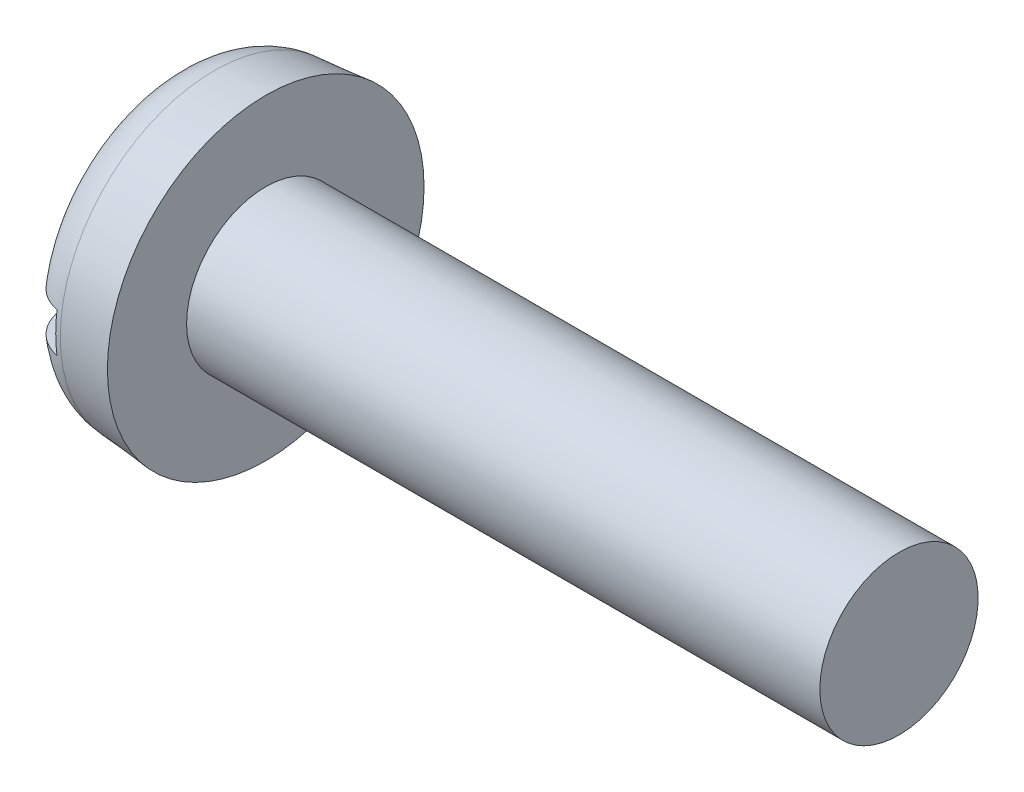
ISO-10303-21;
HEADER;
FILE_DESCRIPTION(('STEP AP214'),'2;1');
FILE_NAME('part.step','',(''),(''),'','','');
FILE_SCHEMA(('AUTOMOTIVE_DESIGN { 1 0 10303 214 1 1 1 1 }'));
ENDSEC;
DATA;
#1=APPLICATION_CONTEXT('core data for automotive mechanical design processes');
#2=APPLICATION_PROTOCOL_DEFINITION('international standard','automotive_design',2000,#1);
#3=PRODUCT_CONTEXT('',#1,'mechanical');
#4=PRODUCT('Part','Part','',(#3));
#5=PRODUCT_RELATED_PRODUCT_CATEGORY('part','',(#4));
#6=PRODUCT_DEFINITION_FORMATION('','',#4);
#7=PRODUCT_DEFINITION_CONTEXT('part definition',#1,'design');
#8=PRODUCT_DEFINITION('design','',#6,#7);
#9=PRODUCT_DEFINITION_SHAPE('','',#8);
#10=(LENGTH_UNIT() NAMED_UNIT(*) SI_UNIT(.MILLI.,.METRE.));
#11=(NAMED_UNIT(*) PLANE_ANGLE_UNIT() SI_UNIT($,.RADIAN.));
#12=(NAMED_UNIT(*) SI_UNIT($,.STERADIAN.) SOLID_ANGLE_UNIT());
#13=UNCERTAINTY_MEASURE_WITH_UNIT(LENGTH_MEASURE(1.E-05),#10,'distance_accuracy_value','');
#14=(GEOMETRIC_REPRESENTATION_CONTEXT(3) GLOBAL_UNCERTAINTY_ASSIGNED_CONTEXT((#13)) GLOBAL_UNIT_ASSIGNED_CONTEXT((#10,
#11,#12)) REPRESENTATION_CONTEXT('',''));
#15=CARTESIAN_POINT('',(0.,0.,0.));
#16=DIRECTION('',(0.,0.,1.));
#17=DIRECTION('',(1.,0.,0.));
#18=AXIS2_PLACEMENT_3D('',#15,#16,#17);
#19=CARTESIAN_POINT('',(0.,0.,0.));
#20=DIRECTION('',(-1.,0.,0.));
#21=DIRECTION('',(0.,0.,1.));
#22=AXIS2_PLACEMENT_3D('',#19,#20,#21);
#23=PLANE('',#22);
#24=DIRECTION('',(0.,0.,-1.));
#25=VECTOR('',#24,1.);
#26=CARTESIAN_POINT('',(0.,1.25,10.));
#27=LINE('',#26,#25);
#28=CARTESIAN_POINT('',(0.,1.25,6.60890143188702));
#29=VERTEX_POINT('',#28);
#30=CARTESIAN_POINT('',(0.,1.25,-6.60890143188702));
#31=VERTEX_POINT('',#30);
#32=EDGE_CURVE('E87',#29,#31,#27,.T.);
#33=ORIENTED_EDGE('',*,*,#32,.F.);
#34=CARTESIAN_POINT('',(0.,0.,0.));
#35=DIRECTION('',(-1.,0.,0.));
#36=DIRECTION('',(0.,0.,1.));
#37=AXIS2_PLACEMENT_3D('',#34,#35,#36);
#38=CIRCLE('',#37,6.72607449679219);
#39=EDGE_CURVE('E93',#29,#31,#38,.T.);
#40=ORIENTED_EDGE('',*,*,#39,.T.);
#41=EDGE_LOOP('',(#33,#40));
#42=FACE_BOUND('',#41,.T.);
#43=ADVANCED_FACE('F34',(#42),#23,.T.);
#44=CARTESIAN_POINT('',(-25.4,0.,0.));
#45=DIRECTION('',(-1.,0.,0.));
#46=DIRECTION('',(0.,0.,1.));
#47=AXIS2_PLACEMENT_3D('',#44,#45,#46);
#48=CYLINDRICAL_SURFACE('',#47,5.);
#49=CARTESIAN_POINT('',(46.,0.,0.));
#50=DIRECTION('',(-1.,0.,0.));
#51=DIRECTION('',(0.,0.,1.));
#52=AXIS2_PLACEMENT_3D('',#49,#50,#51);
#53=CIRCLE('',#52,5.);
#54=CARTESIAN_POINT('',(46.,0.,5.));
#55=VERTEX_POINT('',#54);
#56=EDGE_CURVE('E150',#55,#55,#53,.T.);
#57=ORIENTED_EDGE('',*,*,#56,.T.);
#58=EDGE_LOOP('',(#57));
#59=FACE_BOUND('',#58,.T.);
#60=CARTESIAN_POINT('',(6.,0.,0.));
#61=DIRECTION('',(-1.,0.,0.));
#62=DIRECTION('',(0.,0.,1.));
#63=AXIS2_PLACEMENT_3D('',#60,#61,#62);
#64=CIRCLE('',#63,5.);
#65=CARTESIAN_POINT('',(6.,0.,5.));
#66=VERTEX_POINT('',#65);
#67=EDGE_CURVE('E94',#66,#66,#64,.T.);
#68=ORIENTED_EDGE('',*,*,#67,.F.);
#69=EDGE_LOOP('',(#68));
#70=FACE_BOUND('',#69,.T.);
#71=ADVANCED_FACE('F139',(#59,#70),#48,.T.);
#72=CARTESIAN_POINT('',(6.,5.,0.));
#73=DIRECTION('',(-1.,0.,0.));
#74=DIRECTION('',(0.,0.,1.));
#75=AXIS2_PLACEMENT_3D('',#72,#73,#74);
#76=PLANE('',#75);
#77=CARTESIAN_POINT('',(6.,0.,0.));
#78=DIRECTION('',(-1.,0.,0.));
#79=DIRECTION('',(0.,0.,1.));
#80=AXIS2_PLACEMENT_3D('',#77,#78,#79);
#81=CIRCLE('',#80,10.);
#82=CARTESIAN_POINT('',(6.,0.,10.));
#83=VERTEX_POINT('',#82);
#84=EDGE_CURVE('E99',#83,#83,#81,.T.);
#85=ORIENTED_EDGE('',*,*,#84,.F.);
#86=EDGE_LOOP('',(#85));
#87=FACE_BOUND('',#86,.T.);
#88=ORIENTED_EDGE('',*,*,#67,.T.);
#89=EDGE_LOOP('',(#88));
#90=FACE_BOUND('',#89,.T.);
#91=ADVANCED_FACE('F136',(#87,#90),#76,.F.);
#92=CARTESIAN_POINT('',(0.,0.,0.));
#93=DIRECTION('',(1.,0.,0.));
#94=DIRECTION('',(0.,0.,-1.));
#95=AXIS2_PLACEMENT_3D('',#92,#93,#94);
#96=CONICAL_SURFACE('',#95,9.47506801884446,0.0872664625997167);
#97=CARTESIAN_POINT('',(2.73853277175704,0.,0.));
#98=DIRECTION('',(-1.,0.,0.));
#99=DIRECTION('',(0.,0.,1.));
#100=AXIS2_PLACEMENT_3D('',#97,#98,#99);
#101=CIRCLE('',#100,9.71465859106742);
#102=CARTESIAN_POINT('',(2.73853277175704,0.,9.71465859106742));
#103=VERTEX_POINT('',#102);
#104=EDGE_CURVE('E97',#103,#103,#101,.F.);
#105=ORIENTED_EDGE('',*,*,#104,.T.);
#106=EDGE_LOOP('',(#105));
#107=FACE_BOUND('',#106,.T.);
#108=ORIENTED_EDGE('',*,*,#84,.T.);
#109=EDGE_LOOP('',(#108));
#110=FACE_BOUND('',#109,.T.);
#111=ADVANCED_FACE('F133',(#107,#110),#96,.T.);
#112=DIRECTION('',(0.,0.,1.));
#113=VECTOR('',#112,1.);
#114=CARTESIAN_POINT('',(0.,-1.25,-10.));
#115=LINE('',#114,#113);
#116=CARTESIAN_POINT('',(0.,-1.25,-6.60890143188702));
#117=VERTEX_POINT('',#116);
#118=CARTESIAN_POINT('',(0.,-1.25,6.60890143188702));
#119=VERTEX_POINT('',#118);
#120=EDGE_CURVE('E78',#117,#119,#115,.T.);
#121=ORIENTED_EDGE('',*,*,#120,.F.);
#122=EDGE_CURVE('E85',#117,#119,#38,.T.);
#123=ORIENTED_EDGE('',*,*,#122,.T.);
#124=EDGE_LOOP('',(#121,#123));
#125=FACE_BOUND('',#124,.T.);
#126=ADVANCED_FACE('F84',(#125),#23,.T.);
#127=CARTESIAN_POINT('',(46.,5.,0.));
#128=DIRECTION('',(1.,0.,0.));
#129=DIRECTION('',(0.,0.,-1.));
#130=AXIS2_PLACEMENT_3D('',#127,#128,#129);
#131=PLANE('',#130);
#132=ORIENTED_EDGE('',*,*,#56,.F.);
#133=EDGE_LOOP('',(#132));
#134=FACE_BOUND('',#133,.T.);
#135=ADVANCED_FACE('F126',(#134),#131,.T.);
#136=CARTESIAN_POINT('',(3.,0.,0.));
#137=DIRECTION('',(-1.,0.,0.));
#138=DIRECTION('',(0.,0.,1.));
#139=AXIS2_PLACEMENT_3D('',#136,#137,#138);
#140=TOROIDAL_SURFACE('',#139,6.72607449679219,3.);
#141=CARTESIAN_POINT('',(1.34081251292592,1.25,-9.14041771270556));
#142=CARTESIAN_POINT('',(1.47997004569424,1.25,-9.23364559309569));
#143=CARTESIAN_POINT('',(1.62706942158313,1.25,-9.31523086751065));
#144=CARTESIAN_POINT('',(1.93299124224696,1.25,-9.45262888060047));
#145=CARTESIAN_POINT('',(2.09182681215025,1.25,-9.50841224196599));
#146=CARTESIAN_POINT('',(2.41658159251928,1.25,-9.59246600820484));
#147=CARTESIAN_POINT('',(2.582498533532,1.25,-9.62074515959099));
#148=CARTESIAN_POINT('',(2.91668270329018,1.25,-9.64897084033708));
#149=CARTESIAN_POINT('',(3.08494936349241,1.25,-9.64892410865453));
#150=CARTESIAN_POINT('',(3.41873792670578,1.25,-9.6205489149463));
#151=CARTESIAN_POINT('',(3.58426467998157,1.25,-9.59227747883712));
#152=CARTESIAN_POINT('',(3.9082324846902,1.25,-9.50836629256408));
#153=CARTESIAN_POINT('',(4.06667331296119,1.25,-9.45272568110538));
#154=CARTESIAN_POINT('',(4.37212351875608,1.25,-9.31564696311505));
#155=CARTESIAN_POINT('',(4.51912348159581,1.25,-9.23418788439128));
#156=CARTESIAN_POINT('',(4.79744436134885,1.25,-9.04785785761537));
#157=CARTESIAN_POINT('',(4.92876507107146,1.25,-8.94298660023973));
#158=CARTESIAN_POINT('',(5.17270515894009,1.25,-8.71230286795266));
#159=CARTESIAN_POINT('',(5.28523171361335,1.25,-8.58639226002281));
#160=CARTESIAN_POINT('',(5.48776799061373,1.25,-8.31761117398391));
#161=CARTESIAN_POINT('',(5.57777697392869,1.25,-8.17474013947146));
#162=CARTESIAN_POINT('',(5.73362485853236,1.25,-7.87474584170421));
#163=CARTESIAN_POINT('',(5.79923985500485,1.25,-7.71750629633249));
#164=CARTESIAN_POINT('',(5.90351740818828,1.25,-7.39433678343106));
#165=CARTESIAN_POINT('',(5.94217838759054,1.25,-7.22840630793192));
#166=CARTESIAN_POINT('',(5.99202504296818,1.25,-6.8902471150863));
#167=CARTESIAN_POINT('',(6.0028436876831,1.25,-6.71796433394903));
#168=CARTESIAN_POINT('',(5.99588219118269,1.25,-6.37398151667962));
#169=CARTESIAN_POINT('',(5.97809968117614,1.25,-6.20228152999566));
#170=CARTESIAN_POINT('',(5.91412563432089,1.25,-5.86143261724803));
#171=CARTESIAN_POINT('',(5.86748736278875,1.25,-5.69236752441071));
#172=CARTESIAN_POINT('',(5.74686216088372,1.25,-5.36428557101799));
#173=CARTESIAN_POINT('',(5.67287236389949,1.25,-5.20526976573717));
#174=CARTESIAN_POINT('',(5.49848893509047,1.25,-4.89968131495403));
#175=CARTESIAN_POINT('',(5.3977652792538,1.25,-4.75329681574793));
#176=CARTESIAN_POINT('',(5.17308325743016,1.25,-4.47955663710009));
#177=CARTESIAN_POINT('',(5.04912274702775,1.25,-4.3522027158481));
#178=CARTESIAN_POINT('',(4.78177797255637,1.25,-4.12101899516749));
#179=CARTESIAN_POINT('',(4.63847541785345,1.25,-4.0170949006365));
#180=CARTESIAN_POINT('',(4.33591165308452,1.25,-3.83586047496544));
#181=CARTESIAN_POINT('',(4.17665481124267,1.25,-3.75854288463707));
#182=CARTESIAN_POINT('',(3.85300941665427,1.25,-3.63615461860417));
#183=CARTESIAN_POINT('',(3.68903889213839,1.25,-3.58998088339251));
#184=CARTESIAN_POINT('',(3.35552430862095,1.25,-3.52750009872167));
#185=CARTESIAN_POINT('',(3.18598268929377,1.25,-3.51118014865231));
#186=CARTESIAN_POINT('',(2.85540041439991,1.25,-3.50925867978971));
#187=CARTESIAN_POINT('',(2.69436660193266,1.25,-3.52213490652204));
#188=CARTESIAN_POINT('',(2.37679746951337,1.25,-3.57489222130239));
#189=CARTESIAN_POINT('',(2.22026226562944,1.25,-3.61477400546699));
#190=CARTESIAN_POINT('',(1.91661079939741,1.25,-3.71960592153277));
#191=CARTESIAN_POINT('',(1.76945756351056,1.25,-3.78444951321494));
#192=CARTESIAN_POINT('',(1.48742680552422,1.25,-3.93683229612311));
#193=CARTESIAN_POINT('',(1.35255176741993,1.25,-4.02437606608381));
#194=CARTESIAN_POINT('',(1.09216492745924,1.25,-4.22401407493451));
#195=CARTESIAN_POINT('',(0.967387650924978,1.25,-4.33706621584735));
#196=CARTESIAN_POINT('',(0.73758515533178,1.25,-4.58172455320384));
#197=CARTESIAN_POINT('',(0.632564121372695,1.25,-4.71333467060289));
#198=CARTESIAN_POINT('',(0.440706744818381,1.25,-4.99764835034063));
#199=CARTESIAN_POINT('',(0.354858371169426,1.25,-5.15101980535205));
#200=CARTESIAN_POINT('',(0.209759739085442,1.25,-5.46987555953257));
#201=CARTESIAN_POINT('',(0.150511854548873,1.25,-5.63536093824835));
#202=CARTESIAN_POINT('',(0.0598248408899945,1.25,-5.97596403674756));
#203=CARTESIAN_POINT('',(0.0287331300301613,1.25,-6.15117451260019));
#204=CARTESIAN_POINT('',(-0.00327991665943455,1.25,-6.50433093601113));
#205=CARTESIAN_POINT('',(-0.0042034483289247,1.25,-6.68227668353502));
#206=CARTESIAN_POINT('',(0.0242494335281846,1.25,-7.03395549202798));
#207=CARTESIAN_POINT('',(0.0533248623160846,1.25,-7.20771284306739));
#208=CARTESIAN_POINT('',(0.140732202567236,1.25,-7.54776258015318));
#209=CARTESIAN_POINT('',(0.199069128576322,1.25,-7.7140536813841));
#210=CARTESIAN_POINT('',(0.342342853890434,1.25,-8.03161087152442));
#211=CARTESIAN_POINT('',(0.426850513461393,1.25,-8.18307087677514));
#212=CARTESIAN_POINT('',(0.620392149606268,1.25,-8.46922964633382));
#213=CARTESIAN_POINT('',(0.729393933384485,1.25,-8.60395005391848));
#214=CARTESIAN_POINT('',(0.923342283736372,1.25,-8.80549358446353));
#215=CARTESIAN_POINT('',(1.00176332541539,1.25,-8.87870697306255));
#216=CARTESIAN_POINT('',(1.16597654194715,1.25,-9.01634176316588));
#217=CARTESIAN_POINT('',(1.25176865758217,1.25,-9.08076323529194));
#218=CARTESIAN_POINT('',(1.34081251292592,1.25,-9.14041771270556));
#219=B_SPLINE_CURVE_WITH_KNOTS('',3,(#141,#142,#143,#144,#145,#146,#147,#148,#149,#150,#151,
#152,#153,#154,#155,#156,#157,#158,#159,#160,#161,#162,#163,#164,#165,#166,#167,#168,#169,#170,
#171,#172,#173,#174,#175,#176,#177,#178,#179,#180,#181,#182,#183,#184,#185,#186,#187,#188,#189,
#190,#191,#192,#193,#194,#195,#196,#197,#198,#199,#200,#201,#202,#203,#204,#205,#206,#207,#208,
#209,#210,#211,#212,#213,#214,#215,#216,#217,#218),.UNSPECIFIED.,.T.,.F.,(4,2,2,2,2,2,2,2,2,2,2,
2,2,2,2,2,2,2,2,2,2,2,2,2,2,2,2,2,2,2,2,2,2,2,2,2,2,2,4),(0.,0.502110766823819,1.00479182360661,
1.50731297231386,2.00971456720754,2.51110314714071,3.012507506542,3.51432020215663,
4.01613952815144,4.52036837756644,5.02461377327644,5.53337945318342,6.04217490279723,
6.55764396986779,7.07315573107046,7.59685536739773,8.1206099062989,8.65115781760801,
9.18175471470999,9.71017647084869,10.238453940464,10.7468704948707,11.2550672970903,
11.7373799480992,12.2197050320531,12.6999939151031,13.1803797501818,13.6832676754649,
14.1862620112653,14.7111036164068,15.2359920505046,15.7672721553405,16.2985135900082,
16.8244763350858,17.3505292452641,17.8683760107229,18.3855461065789,18.706838362612,
19.0281280376886),.UNSPECIFIED.);
#220=CARTESIAN_POINT('',(2.4,1.25,-9.58429232182582));
#221=VERTEX_POINT('',#220);
#222=EDGE_CURVE('E11',#31,#221,#219,.T.);
#223=ORIENTED_EDGE('',*,*,#222,.F.);
#224=ORIENTED_EDGE('',*,*,#39,.F.);
#225=CARTESIAN_POINT('',(1.26382191448386,1.25,4.09288311147665));
#226=CARTESIAN_POINT('',(1.39631174049083,1.25,3.99458178693507));
#227=CARTESIAN_POINT('',(1.53683479419004,1.25,3.90696138563428));
#228=CARTESIAN_POINT('',(1.83053177402466,1.25,3.75610676855322));
#229=CARTESIAN_POINT('',(1.98371360855086,1.25,3.69288793928877));
#230=CARTESIAN_POINT('',(2.29892040884167,1.25,3.59332982093983));
#231=CARTESIAN_POINT('',(2.46096015163632,1.25,3.55703701691806));
#232=CARTESIAN_POINT('',(2.78884813975658,1.25,3.51321694522641));
#233=CARTESIAN_POINT('',(2.95469492654351,1.25,3.50567884028135));
#234=CARTESIAN_POINT('',(3.27994031590815,1.25,3.51948431548739));
#235=CARTESIAN_POINT('',(3.4393779788812,1.25,3.53992920084695));
#236=CARTESIAN_POINT('',(3.7525839836862,1.25,3.60718385763894));
#237=CARTESIAN_POINT('',(3.90635165919838,1.25,3.65399671730167));
#238=CARTESIAN_POINT('',(4.20491167676621,1.25,3.77236774586462));
#239=CARTESIAN_POINT('',(4.34965447426423,1.25,3.84405037065458));
#240=CARTESIAN_POINT('',(4.6258476142357,1.25,4.0095731011151));
#241=CARTESIAN_POINT('',(4.75729521292,1.25,4.10341776719225));
#242=CARTESIAN_POINT('',(5.01008641199646,1.25,4.31560294700646));
#243=CARTESIAN_POINT('',(5.13060261980442,1.25,4.43492945069355));
#244=CARTESIAN_POINT('',(5.35084651768526,1.25,4.6914352156195));
#245=CARTESIAN_POINT('',(5.45057006805906,1.25,4.82861802313244));
#246=CARTESIAN_POINT('',(5.63028092770194,1.25,5.1229193612593));
#247=CARTESIAN_POINT('',(5.70932861717152,1.25,5.28061277345134));
#248=CARTESIAN_POINT('',(5.84008253616469,1.25,5.60696299442248));
#249=CARTESIAN_POINT('',(5.89178690810357,1.25,5.77562054718325));
#250=CARTESIAN_POINT('',(5.96656074878462,1.25,6.12062107709554));
#251=CARTESIAN_POINT('',(5.98939433008664,1.25,6.2970153333371));
#252=CARTESIAN_POINT('',(6.00475651353572,1.25,6.65112545180573));
#253=CARTESIAN_POINT('',(5.99728647982668,1.25,6.82884125418276));
#254=CARTESIAN_POINT('',(5.95226956896528,1.25,7.17835050000592));
#255=CARTESIAN_POINT('',(5.9150694668104,1.25,7.35018854180243));
#256=CARTESIAN_POINT('',(5.81186963022159,1.25,7.68499211526658));
#257=CARTESIAN_POINT('',(5.74587228488445,1.25,7.84795838169935));
#258=CARTESIAN_POINT('',(5.58811425407858,1.25,8.15759311400099));
#259=CARTESIAN_POINT('',(5.49678615107476,1.25,8.30448200348222));
#260=CARTESIAN_POINT('',(5.29044367537783,1.25,8.58055953881112));
#261=CARTESIAN_POINT('',(5.17543111504442,1.25,8.70974953773769));
#262=CARTESIAN_POINT('',(4.92670266462773,1.25,8.94491272753476));
#263=CARTESIAN_POINT('',(4.79326400713053,1.25,9.05117920985976));
#264=CARTESIAN_POINT('',(4.51029957824172,1.25,9.23954806990295));
#265=CARTESIAN_POINT('',(4.36077469528137,1.25,9.32165178117987));
#266=CARTESIAN_POINT('',(4.05140347732905,1.25,9.45858963475477));
#267=CARTESIAN_POINT('',(3.89166723220348,1.25,9.51367257457184));
#268=CARTESIAN_POINT('',(3.56518951501209,1.25,9.59608516590055));
#269=CARTESIAN_POINT('',(3.39844827666334,1.25,9.62341574258723));
#270=CARTESIAN_POINT('',(3.06360210216765,1.25,9.64944728743541));
#271=CARTESIAN_POINT('',(2.89550841197153,1.25,9.64829313122123));
#272=CARTESIAN_POINT('',(2.56190846549621,1.25,9.61774706731307));
#273=CARTESIAN_POINT('',(2.39640217605877,1.25,9.5883555217909));
#274=CARTESIAN_POINT('',(2.07284859259807,1.25,9.50224487444937));
#275=CARTESIAN_POINT('',(1.91479362182141,1.25,9.44555460404127));
#276=CARTESIAN_POINT('',(1.61040732738865,1.25,9.30651671205418));
#277=CARTESIAN_POINT('',(1.46407606128383,1.25,9.2241689645332));
#278=CARTESIAN_POINT('',(1.18681533787692,1.25,9.03593655279674));
#279=CARTESIAN_POINT('',(1.05593137819663,1.25,8.92998488938137));
#280=CARTESIAN_POINT('',(0.813660408613398,1.25,8.69774897897805));
#281=CARTESIAN_POINT('',(0.702273903404625,1.25,8.57146420582728));
#282=CARTESIAN_POINT('',(0.50129795463969,1.25,8.30123763749748));
#283=CARTESIAN_POINT('',(0.411865043630166,1.25,8.15717945566492));
#284=CARTESIAN_POINT('',(0.258151656288224,1.25,7.85622272929764));
#285=CARTESIAN_POINT('',(0.193872422542943,1.25,7.69932355088282));
#286=CARTESIAN_POINT('',(0.0914844789700434,1.25,7.3752775799558));
#287=CARTESIAN_POINT('',(0.0536765559286275,1.25,7.208035789828));
#288=CARTESIAN_POINT('',(0.00623193497221558,1.25,6.86961495105199));
#289=CARTESIAN_POINT('',(-0.0034038624194423,1.25,6.69843577672136));
#290=CARTESIAN_POINT('',(0.00559527837112659,1.25,6.35428826800001));
#291=CARTESIAN_POINT('',(0.0246509188296341,1.25,6.18133097034173));
#292=CARTESIAN_POINT('',(0.0910744324686452,1.25,5.84089682174407));
#293=CARTESIAN_POINT('',(0.138451445760776,1.25,5.67342175848973));
#294=CARTESIAN_POINT('',(0.2610414332528,1.25,5.34594500453947));
#295=CARTESIAN_POINT('',(0.336686545987239,1.25,5.18610522138191));
#296=CARTESIAN_POINT('',(0.513520307275829,1.25,4.88138088430097));
#297=CARTESIAN_POINT('',(0.614684448217062,1.25,4.73648216850751));
#298=CARTESIAN_POINT('',(0.806158938188778,1.25,4.50617052290275));
#299=CARTESIAN_POINT('',(0.890708147771373,1.25,4.41590482765064));
#300=CARTESIAN_POINT('',(1.06994471658435,1.25,4.24605829608903));
#301=CARTESIAN_POINT('',(1.16463203429131,1.25,4.16647741601995));
#302=CARTESIAN_POINT('',(1.26382191448386,1.25,4.09288311147665));
#303=B_SPLINE_CURVE_WITH_KNOTS('',3,(#225,#226,#227,#228,#229,#230,#231,#232,#233,#234,#235,
#236,#237,#238,#239,#240,#241,#242,#243,#244,#245,#246,#247,#248,#249,#250,#251,#252,#253,#254,
#255,#256,#257,#258,#259,#260,#261,#262,#263,#264,#265,#266,#267,#268,#269,#270,#271,#272,#273,
#274,#275,#276,#277,#278,#279,#280,#281,#282,#283,#284,#285,#286,#287,#288,#289,#290,#291,#292,
#293,#294,#295,#296,#297,#298,#299,#300,#301,#302),.UNSPECIFIED.,.T.,.F.,(4,2,2,2,2,2,2,2,2,2,2,
2,2,2,2,2,2,2,2,2,2,2,2,2,2,2,2,2,2,2,2,2,2,2,2,2,2,2,4),(0.,0.494505492688236,
0.989322290526773,1.48499136435713,1.98047360843902,2.46041092798689,2.94040446972447,
3.42283554385279,3.9053659771431,4.41188934389407,4.91851346045541,5.44523072468734,
5.97198376717834,6.50301338186936,7.03401909206045,7.55891993261561,8.08377723426182,
8.60017143275781,9.11652613089799,9.62582070526196,10.1350871660602,10.6395720992999,
11.1440402140728,11.6459430949978,12.1478395386192,12.649207065567,13.1505770535601,
13.6533887241775,14.1562134082168,14.6625254588187,15.1688625179883,15.6808634683425,
16.1928807846526,16.7124792701269,17.2322455353936,17.7603061753296,18.2878616016413,
18.6580797756947,19.0282964334758),.UNSPECIFIED.);
#304=CARTESIAN_POINT('',(2.4,1.25,9.58429232182582));
#305=VERTEX_POINT('',#304);
#306=EDGE_CURVE('E111',#305,#29,#303,.T.);
#307=ORIENTED_EDGE('',*,*,#306,.F.);
#308=CARTESIAN_POINT('',(2.4,0.,0.));
#309=DIRECTION('',(-1.,0.,0.));
#310=DIRECTION('',(0.,0.,1.));
#311=AXIS2_PLACEMENT_3D('',#308,#309,#310);
#312=CIRCLE('',#311,9.665462188132);
#313=CARTESIAN_POINT('',(2.4,-1.25,9.58429232182582));
#314=VERTEX_POINT('',#313);
#315=EDGE_CURVE('E105',#305,#314,#312,.F.);
#316=ORIENTED_EDGE('',*,*,#315,.T.);
#317=CARTESIAN_POINT('',(1.26382191448385,-1.25,4.09288311147665));
#318=CARTESIAN_POINT('',(1.12281074341645,-1.25,4.19752142156724));
#319=CARTESIAN_POINT('',(0.990698850631708,-1.25,4.31441743155047));
#320=CARTESIAN_POINT('',(0.747870102900131,-1.25,4.56888367838225));
#321=CARTESIAN_POINT('',(0.637190621123716,-1.25,4.70648929872284));
#322=CARTESIAN_POINT('',(0.440429203137234,-1.25,4.99804902453721));
#323=CARTESIAN_POINT('',(0.354316213703694,-1.25,5.15198215039682));
#324=CARTESIAN_POINT('',(0.20891735437685,-1.25,5.47195794385446));
#325=CARTESIAN_POINT('',(0.149620932729131,-1.25,5.63799581857402));
#326=CARTESIAN_POINT('',(0.0591591122404719,-1.25,5.97919547815131));
#327=CARTESIAN_POINT('',(0.0282535671622448,-1.25,6.15442632165322));
#328=CARTESIAN_POINT('',(-0.00338918998445487,-1.25,6.5076127933338));
#329=CARTESIAN_POINT('',(-0.00412508383878786,-1.25,6.68556854023285));
#330=CARTESIAN_POINT('',(0.0247048720204433,-1.25,7.03724099585074));
#331=CARTESIAN_POINT('',(0.0539706760993967,-1.25,7.21098223268442));
#332=CARTESIAN_POINT('',(0.141741697564914,-1.25,7.55091873550931));
#333=CARTESIAN_POINT('',(0.20024431176775,-1.25,7.71711467188124));
#334=CARTESIAN_POINT('',(0.34380438867397,-1.25,8.03439272394412));
#335=CARTESIAN_POINT('',(0.428419792627877,-1.25,8.18567487312934));
#336=CARTESIAN_POINT('',(0.622195699557508,-1.25,8.47160793819821));
#337=CARTESIAN_POINT('',(0.731354229308534,-1.25,8.60626018974915));
#338=CARTESIAN_POINT('',(0.96942477703014,-1.25,8.85310619781115));
#339=CARTESIAN_POINT('',(1.09803469154371,-1.25,8.96559138190278));
#340=CARTESIAN_POINT('',(1.37247594147221,-1.25,9.1671108824906));
#341=CARTESIAN_POINT('',(1.51830629626277,-1.25,9.25614653339733));
#342=CARTESIAN_POINT('',(1.82146880951236,-1.25,9.40733759254943));
#343=CARTESIAN_POINT('',(1.97867156112613,-1.25,9.46975256148445));
#344=CARTESIAN_POINT('',(2.30135991080932,-1.25,9.56713490021207));
#345=CARTESIAN_POINT('',(2.4668452049354,-1.25,9.60210327642414));
#346=CARTESIAN_POINT('',(2.80039759453263,-1.25,9.64343725630827));
#347=CARTESIAN_POINT('',(2.96844482474853,-1.25,9.64996332005038));
#348=CARTESIAN_POINT('',(3.30324155734625,-1.25,9.6346603574858));
#349=CARTESIAN_POINT('',(3.46999107987819,-1.25,9.61283177234253));
#350=CARTESIAN_POINT('',(3.79718728026458,-1.25,9.54151976124886));
#351=CARTESIAN_POINT('',(3.9576435405535,-1.25,9.49208027749995));
#352=CARTESIAN_POINT('',(4.26800546288279,-1.25,9.36702530931329));
#353=CARTESIAN_POINT('',(4.4179110923608,-1.25,9.29140974409268));
#354=CARTESIAN_POINT('',(4.70331583726214,-1.25,9.11599680974362));
#355=CARTESIAN_POINT('',(4.83878039553571,-1.25,9.01614322967451));
#356=CARTESIAN_POINT('',(5.09115301260605,-1.25,8.79524289883293));
#357=CARTESIAN_POINT('',(5.20806065823769,-1.25,8.67419567631533));
#358=CARTESIAN_POINT('',(5.42083261429217,-1.25,8.41354747734203));
#359=CARTESIAN_POINT('',(5.51655799203612,-1.25,8.27383311732979));
#360=CARTESIAN_POINT('',(5.68347418998202,-1.25,7.98045265438222));
#361=CARTESIAN_POINT('',(5.75466396357057,-1.25,7.82678595663625));
#362=CARTESIAN_POINT('',(5.87133394011431,-1.25,7.50813812555974));
#363=CARTESIAN_POINT('',(5.91653366078909,-1.25,7.3430543364656));
#364=CARTESIAN_POINT('',(5.97900569146414,-1.25,7.00769021516324));
#365=CARTESIAN_POINT('',(5.99627609782638,-1.25,6.83740952954491));
#366=CARTESIAN_POINT('',(6.00268828786137,-1.25,6.49385300485889));
#367=CARTESIAN_POINT('',(5.99141884042278,-1.25,6.32056951960876));
#368=CARTESIAN_POINT('',(5.9404210674208,-1.25,5.97824398252177));
#369=CARTESIAN_POINT('',(5.90069018354779,-1.25,5.80920231338238));
#370=CARTESIAN_POINT('',(5.79317703159895,-1.25,5.47732529012842));
#371=CARTESIAN_POINT('',(5.72496109120794,-1.25,5.31463035866646));
#372=CARTESIAN_POINT('',(5.56242137927155,-1.25,5.00283223239777));
#373=CARTESIAN_POINT('',(5.46809456075774,-1.25,4.85373062654411));
#374=CARTESIAN_POINT('',(5.25495485524007,-1.25,4.57213876059514));
#375=CARTESIAN_POINT('',(5.13593814702498,-1.25,4.43980256801185));
#376=CARTESIAN_POINT('',(4.87705851131383,-1.25,4.19733582914035));
#377=CARTESIAN_POINT('',(4.73719542661853,-1.25,4.08720545031741));
#378=CARTESIAN_POINT('',(4.44272329711494,-1.25,3.89454641069043));
#379=CARTESIAN_POINT('',(4.28838268681137,-1.25,3.81160846519194));
#380=CARTESIAN_POINT('',(3.96747535241713,-1.25,3.6743489249903));
#381=CARTESIAN_POINT('',(3.80091453411058,-1.25,3.62001360965165));
#382=CARTESIAN_POINT('',(3.46897458453872,-1.25,3.54439614362301));
#383=CARTESIAN_POINT('',(3.30393261150565,-1.25,3.52163376893006));
#384=CARTESIAN_POINT('',(2.9723850287921,-1.25,3.50541724009696));
#385=CARTESIAN_POINT('',(2.80587941319277,-1.25,3.51196320453178));
#386=CARTESIAN_POINT('',(2.48303155958456,-1.25,3.55319863346028));
#387=CARTESIAN_POINT('',(2.32654576676978,-1.25,3.5867850316608));
#388=CARTESIAN_POINT('',(2.02138294742915,-1.25,3.6792339163955));
#389=CARTESIAN_POINT('',(1.87269750876151,-1.25,3.73806851835939));
#390=CARTESIAN_POINT('',(1.64800101777053,-1.25,3.84858253593086));
#391=CARTESIAN_POINT('',(1.5681016361628,-1.25,3.89256303265035));
#392=CARTESIAN_POINT('',(1.41260969363804,-1.25,3.98755607648008));
#393=CARTESIAN_POINT('',(1.33701691074472,-1.25,4.03856826068966));
#394=CARTESIAN_POINT('',(1.26382191448385,-1.25,4.09288311147665));
#395=B_SPLINE_CURVE_WITH_KNOTS('',3,(#317,#318,#319,#320,#321,#322,#323,#324,#325,#326,#327,
#328,#329,#330,#331,#332,#333,#334,#335,#336,#337,#338,#339,#340,#341,#342,#343,#344,#345,#346,
#347,#348,#349,#350,#351,#352,#353,#354,#355,#356,#357,#358,#359,#360,#361,#362,#363,#364,#365,
#366,#367,#368,#369,#370,#371,#372,#373,#374,#375,#376,#377,#378,#379,#380,#381,#382,#383,#384,
#385,#386,#387,#388,#389,#390,#391,#392,#393,#394),.UNSPECIFIED.,.T.,.F.,(4,2,2,2,2,2,2,2,2,2,2,
2,2,2,2,2,2,2,2,2,2,2,2,2,2,2,2,2,2,2,2,2,2,2,2,2,2,2,4),(0.,0.526440111479223,1.05379010567381,
1.58047052031741,2.10694351662079,2.63818851120178,3.1694567176493,3.69546307977911,
4.22142261575713,4.73892601758567,5.25638782790747,5.76651089230141,6.27660492154396,
6.78160488278285,7.28658632567446,7.78871514825128,8.29083615841544,8.792160320787,
9.29348603032546,9.79598567435052,10.2984965048386,10.8042115157151,11.3099480961693,
11.8210447773653,12.3321762930032,12.8507144840889,13.369299290802,13.8960850697997,
14.4229323471802,14.95431552167,15.485702703439,16.0086791951238,16.5314045866922,
17.0286845224232,17.5259664700392,18.0039322882727,18.4813715855165,18.7546461758137,
19.0279066678698),.UNSPECIFIED.);
#396=EDGE_CURVE('E92',#119,#314,#395,.T.);
#397=ORIENTED_EDGE('',*,*,#396,.F.);
#398=ORIENTED_EDGE('',*,*,#122,.F.);
#399=CARTESIAN_POINT('',(1.34081251292592,-1.25,-9.14041771270556));
#400=CARTESIAN_POINT('',(1.20015060949045,-1.25,-9.04616345437989));
#401=CARTESIAN_POINT('',(1.06739622225896,-1.25,-8.93987123380139));
#402=CARTESIAN_POINT('',(0.821572584155474,-1.25,-8.70635450043818));
#403=CARTESIAN_POINT('',(0.70852930536039,-1.25,-8.57910279337248));
#404=CARTESIAN_POINT('',(0.505461249898454,-1.25,-8.30757102508842));
#405=CARTESIAN_POINT('',(0.41541519841045,-1.25,-8.16330688409781));
#406=CARTESIAN_POINT('',(0.260623184303374,-1.25,-7.86185378951104));
#407=CARTESIAN_POINT('',(0.195870889900428,-1.25,-7.70466808251058));
#408=CARTESIAN_POINT('',(0.0928000609338856,-1.25,-7.38039972887707));
#409=CARTESIAN_POINT('',(0.0547091329283606,-1.25,-7.21324477711425));
#410=CARTESIAN_POINT('',(0.00668481608254998,-1.25,-6.87493612044758));
#411=CARTESIAN_POINT('',(-0.00324544320407009,-1.25,-6.70378197323566));
#412=CARTESIAN_POINT('',(0.00516243771007449,-1.25,-6.3596214618715));
#413=CARTESIAN_POINT('',(0.0239236303987532,-1.25,-6.18662545769902));
#414=CARTESIAN_POINT('',(0.0897609564265252,-1.25,-5.84610874147648));
#415=CARTESIAN_POINT('',(0.13683968673972,-1.25,-5.67858853309219));
#416=CARTESIAN_POINT('',(0.258821424431443,-1.25,-5.35102736402038));
#417=CARTESIAN_POINT('',(0.334145570832705,-1.25,-5.19114314277549));
#418=CARTESIAN_POINT('',(0.510387505205578,-1.25,-4.88614144255742));
#419=CARTESIAN_POINT('',(0.611308238097231,-1.25,-4.74102566540639));
#420=CARTESIAN_POINT('',(0.836792517278867,-1.25,-4.46885245516553));
#421=CARTESIAN_POINT('',(0.961506823054627,-1.25,-4.34191973468684));
#422=CARTESIAN_POINT('',(1.23086269838975,-1.25,-4.11127536693011));
#423=CARTESIAN_POINT('',(1.37550342526052,-1.25,-4.00756273816077));
#424=CARTESIAN_POINT('',(1.67768102781937,-1.25,-3.82897472179845));
#425=CARTESIAN_POINT('',(1.8348959230502,-1.25,-3.75355591162895));
#426=CARTESIAN_POINT('',(2.1602029356313,-1.25,-3.63181313665331));
#427=CARTESIAN_POINT('',(2.32828995546906,-1.25,-3.58547564427938));
#428=CARTESIAN_POINT('',(2.66136883354913,-1.25,-3.52569372090417));
#429=CARTESIAN_POINT('',(2.82608186670431,-1.25,-3.51069330259667));
#430=CARTESIAN_POINT('',(3.15558374254515,-1.25,-3.50963020511807));
#431=CARTESIAN_POINT('',(3.32037256352142,-1.25,-3.52356174737946));
#432=CARTESIAN_POINT('',(3.63962543018491,-1.25,-3.5787287176116));
#433=CARTESIAN_POINT('',(3.79425061126297,-1.25,-3.61904183081106));
#434=CARTESIAN_POINT('',(4.09483474255198,-1.25,-3.7243656331911));
#435=CARTESIAN_POINT('',(4.24079234157891,-1.25,-3.78938016143436));
#436=CARTESIAN_POINT('',(4.52432841772081,-1.25,-3.9438493720449));
#437=CARTESIAN_POINT('',(4.6615685296473,-1.25,-4.0339238815296));
#438=CARTESIAN_POINT('',(4.91996185117386,-1.25,-4.23475967228909));
#439=CARTESIAN_POINT('',(5.04111149093129,-1.25,-4.34552553108615));
#440=CARTESIAN_POINT('',(5.270356678433,-1.25,-4.59082905859705));
#441=CARTESIAN_POINT('',(5.37745666903982,-1.25,-4.72629814107703));
#442=CARTESIAN_POINT('',(5.56814264193741,-1.25,-5.01288886880269));
#443=CARTESIAN_POINT('',(5.65172490539111,-1.25,-5.16401298440127));
#444=CARTESIAN_POINT('',(5.79513140936541,-1.25,-5.48224187117628));
#445=CARTESIAN_POINT('',(5.85423067399696,-1.25,-5.64967408503921));
#446=CARTESIAN_POINT('',(5.94344652310615,-1.25,-5.99209807576279));
#447=CARTESIAN_POINT('',(5.97356262451575,-1.25,-6.16708997857147));
#448=CARTESIAN_POINT('',(6.00371708096925,-1.25,-6.51942213021357));
#449=CARTESIAN_POINT('',(6.00379592884454,-1.25,-6.69675889523921));
#450=CARTESIAN_POINT('',(5.97371855966502,-1.25,-7.04885549679174));
#451=CARTESIAN_POINT('',(5.94356439236003,-1.25,-7.22361550720338));
#452=CARTESIAN_POINT('',(5.85432397761248,-1.25,-7.5628624949037));
#453=CARTESIAN_POINT('',(5.79566613491294,-1.25,-7.72746213180111));
#454=CARTESIAN_POINT('',(5.65111484052759,-1.25,-8.04423757814382));
#455=CARTESIAN_POINT('',(5.5652236215919,-1.25,-8.19641440479748));
#456=CARTESIAN_POINT('',(5.37011745148606,-1.25,-8.48150036841839));
#457=CARTESIAN_POINT('',(5.26128867120818,-1.25,-8.6146738388773));
#458=CARTESIAN_POINT('',(5.02256847636095,-1.25,-8.86057639945768));
#459=CARTESIAN_POINT('',(4.89267847610927,-1.25,-8.97330686130619));
#460=CARTESIAN_POINT('',(4.61723622383291,-1.25,-9.17370861131066));
#461=CARTESIAN_POINT('',(4.47189262677195,-1.25,-9.26166675845636));
#462=CARTESIAN_POINT('',(4.1684196634262,-1.25,-9.4117085259297));
#463=CARTESIAN_POINT('',(4.01029141555484,-1.25,-9.47379440666981));
#464=CARTESIAN_POINT('',(3.6870727229546,-1.25,-9.56986613834804));
#465=CARTESIAN_POINT('',(3.52204663401372,-1.25,-9.60406862881753));
#466=CARTESIAN_POINT('',(3.18854472432699,-1.25,-9.6441799773532));
#467=CARTESIAN_POINT('',(3.02006811248823,-1.25,-9.6500822724981));
#468=CARTESIAN_POINT('',(2.68506114287552,-1.25,-9.63343641979618));
#469=CARTESIAN_POINT('',(2.51852641695644,-1.25,-9.610974969983));
#470=CARTESIAN_POINT('',(2.19174162713313,-1.25,-9.53841625192782));
#471=CARTESIAN_POINT('',(2.03148397150639,-1.25,-9.48835354517748));
#472=CARTESIAN_POINT('',(1.78279682289461,-1.25,-9.38706125023147));
#473=CARTESIAN_POINT('',(1.69093096553374,-1.25,-9.34405263098262));
#474=CARTESIAN_POINT('',(1.5120365456703,-1.25,-9.24893955644847));
#475=CARTESIAN_POINT('',(1.42500797102964,-1.25,-9.19683512398847));
#476=CARTESIAN_POINT('',(1.34081251292592,-1.25,-9.14041771270556));
#477=B_SPLINE_CURVE_WITH_KNOTS('',3,(#399,#400,#401,#402,#403,#404,#405,#406,#407,#408,#409,
#410,#411,#412,#413,#414,#415,#416,#417,#418,#419,#420,#421,#422,#423,#424,#425,#426,#427,#428,
#429,#430,#431,#432,#433,#434,#435,#436,#437,#438,#439,#440,#441,#442,#443,#444,#445,#446,#447,
#448,#449,#450,#451,#452,#453,#454,#455,#456,#457,#458,#459,#460,#461,#462,#463,#464,#465,#466,
#467,#468,#469,#470,#471,#472,#473,#474,#475,#476),.UNSPECIFIED.,.T.,.F.,(4,2,2,2,2,2,2,2,2,2,2,
2,2,2,2,2,2,2,2,2,2,2,2,2,2,2,2,2,2,2,2,2,2,2,2,2,2,2,4),(0.,0.507588671036851,1.01584118681693,
1.52362179909577,2.03127521711604,2.54321125824044,3.05520418965239,3.57481951927497,
4.09448250958617,4.62222340620202,5.15002504764787,5.68128920058432,6.21253089324602,
6.7329718636751,7.25317056417396,7.74685824491856,8.24044733112708,8.71764104409225,
9.1949089522592,9.68523062294224,10.1756608956385,10.6913858130697,11.2071922358465,
11.7373363908365,12.2674893816895,12.7969276776483,13.326330080969,13.8480108680123,
14.3696488956936,14.8831209261432,15.3965584898319,15.9037800593983,16.4109573046508,
16.9141554487638,17.4174702807689,17.9192503729471,18.4204035730095,18.7242297468764,
19.0280551583235),.UNSPECIFIED.);
#478=CARTESIAN_POINT('',(2.4,-1.25,-9.58429232182582));
#479=VERTEX_POINT('',#478);
#480=EDGE_CURVE('E46',#479,#117,#477,.T.);
#481=ORIENTED_EDGE('',*,*,#480,.F.);
#482=EDGE_CURVE('E58',#479,#221,#312,.F.);
#483=ORIENTED_EDGE('',*,*,#482,.T.);
#484=EDGE_LOOP('',(#223,#224,#307,#316,#397,#398,#481,#483));
#485=FACE_BOUND('',#484,.T.);
#486=ORIENTED_EDGE('',*,*,#104,.F.);
#487=EDGE_LOOP('',(#486));
#488=FACE_BOUND('',#487,.T.);
#489=ADVANCED_FACE('F36',(#485,#488),#140,.T.);
#490=CARTESIAN_POINT('',(2.4,1.25,10.));
#491=DIRECTION('',(0.,1.,0.));
#492=DIRECTION('',(0.,0.,1.));
#493=AXIS2_PLACEMENT_3D('',#490,#491,#492);
#494=PLANE('',#493);
#495=ORIENTED_EDGE('',*,*,#222,.T.);
#496=DIRECTION('',(0.,0.,-1.));
#497=VECTOR('',#496,1.);
#498=CARTESIAN_POINT('',(2.4,1.25,10.));
#499=LINE('',#498,#497);
#500=EDGE_CURVE('E86',#305,#221,#499,.T.);
#501=ORIENTED_EDGE('',*,*,#500,.F.);
#502=ORIENTED_EDGE('',*,*,#306,.T.);
#503=ORIENTED_EDGE('',*,*,#32,.T.);
#504=EDGE_LOOP('',(#495,#501,#502,#503));
#505=FACE_BOUND('',#504,.T.);
#506=ADVANCED_FACE('F118',(#505),#494,.F.);
#507=CARTESIAN_POINT('',(2.4,-1.25,-10.));
#508=DIRECTION('',(0.,-1.,0.));
#509=DIRECTION('',(0.,0.,-1.));
#510=AXIS2_PLACEMENT_3D('',#507,#508,#509);
#511=PLANE('',#510);
#512=ORIENTED_EDGE('',*,*,#480,.T.);
#513=ORIENTED_EDGE('',*,*,#120,.T.);
#514=ORIENTED_EDGE('',*,*,#396,.T.);
#515=DIRECTION('',(0.,0.,1.));
#516=VECTOR('',#515,1.);
#517=CARTESIAN_POINT('',(2.4,-1.25,-10.));
#518=LINE('',#517,#516);
#519=EDGE_CURVE('E53',#479,#314,#518,.T.);
#520=ORIENTED_EDGE('',*,*,#519,.F.);
#521=EDGE_LOOP('',(#512,#513,#514,#520));
#522=FACE_BOUND('',#521,.T.);
#523=ADVANCED_FACE('F77',(#522),#511,.F.);
#524=CARTESIAN_POINT('',(2.4,1.25,-10.));
#525=DIRECTION('',(-1.,0.,0.));
#526=DIRECTION('',(0.,0.,1.));
#527=AXIS2_PLACEMENT_3D('',#524,#525,#526);
#528=PLANE('',#527);
#529=ORIENTED_EDGE('',*,*,#519,.T.);
#530=ORIENTED_EDGE('',*,*,#315,.F.);
#531=ORIENTED_EDGE('',*,*,#500,.T.);
#532=ORIENTED_EDGE('',*,*,#482,.F.);
#533=EDGE_LOOP('',(#529,#530,#531,#532));
#534=FACE_BOUND('',#533,.T.);
#535=ADVANCED_FACE('F117',(#534),#528,.T.);
#536=CLOSED_SHELL('',(#43,#71,#91,#111,#126,#135,#489,#506,#523,#535));
#537=MANIFOLD_SOLID_BREP('B2',#536);
#538=ADVANCED_BREP_SHAPE_REPRESENTATION('',(#18,#537),#14);
#539=SHAPE_DEFINITION_REPRESENTATION(#9,#538);
ENDSEC;
END-ISO-10303-21;
